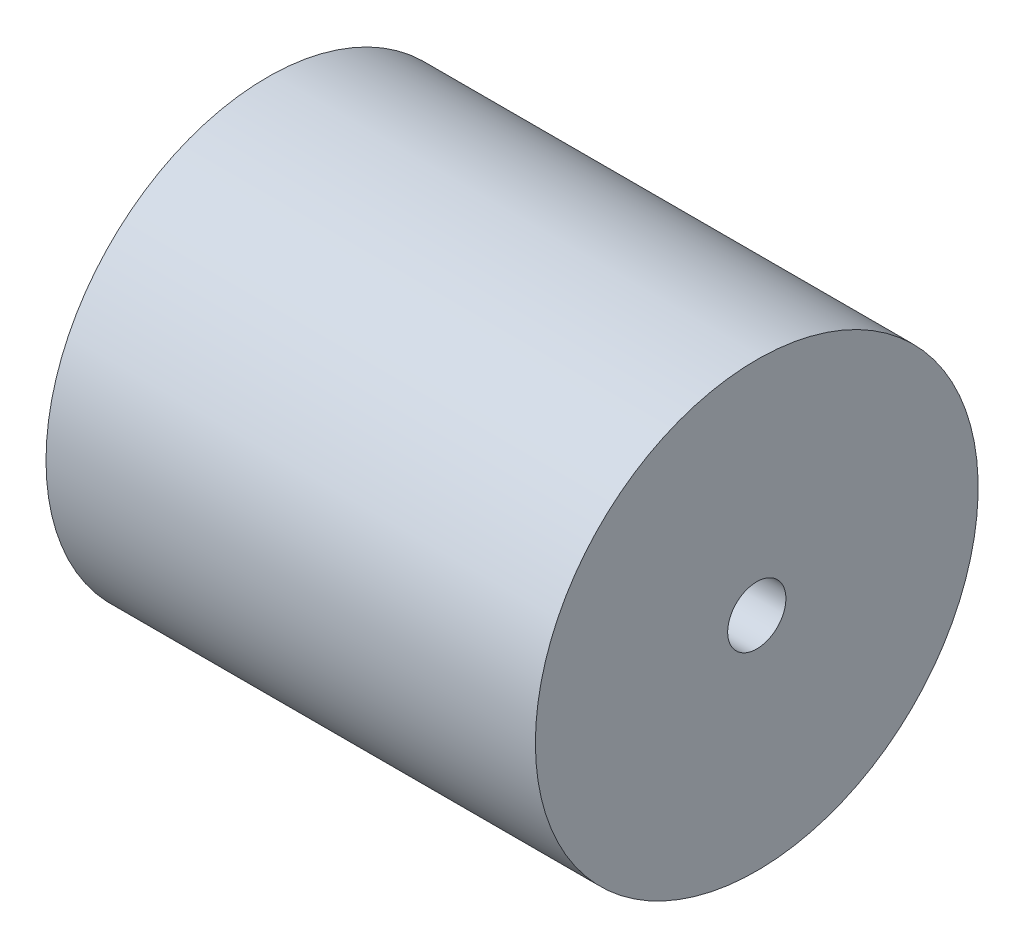
ISO-10303-21;
HEADER;
FILE_DESCRIPTION(('STEP AP214'),'2;1');
FILE_NAME('part.step','',(''),(''),'','','');
FILE_SCHEMA(('AUTOMOTIVE_DESIGN { 1 0 10303 214 1 1 1 1 }'));
ENDSEC;
DATA;
#1=APPLICATION_CONTEXT('core data for automotive mechanical design processes');
#2=APPLICATION_PROTOCOL_DEFINITION('international standard','automotive_design',2000,#1);
#3=PRODUCT_CONTEXT('',#1,'mechanical');
#4=PRODUCT('Part','Part','',(#3));
#5=PRODUCT_RELATED_PRODUCT_CATEGORY('part','',(#4));
#6=PRODUCT_DEFINITION_FORMATION('','',#4);
#7=PRODUCT_DEFINITION_CONTEXT('part definition',#1,'design');
#8=PRODUCT_DEFINITION('design','',#6,#7);
#9=PRODUCT_DEFINITION_SHAPE('','',#8);
#10=(LENGTH_UNIT() NAMED_UNIT(*) SI_UNIT(.MILLI.,.METRE.));
#11=(NAMED_UNIT(*) PLANE_ANGLE_UNIT() SI_UNIT($,.RADIAN.));
#12=(NAMED_UNIT(*) SI_UNIT($,.STERADIAN.) SOLID_ANGLE_UNIT());
#13=UNCERTAINTY_MEASURE_WITH_UNIT(LENGTH_MEASURE(1.E-05),#10,'distance_accuracy_value','');
#14=(GEOMETRIC_REPRESENTATION_CONTEXT(3) GLOBAL_UNCERTAINTY_ASSIGNED_CONTEXT((#13)) GLOBAL_UNIT_ASSIGNED_CONTEXT((#10,
#11,#12)) REPRESENTATION_CONTEXT('',''));
#15=CARTESIAN_POINT('',(0.,0.,0.));
#16=DIRECTION('',(0.,0.,1.));
#17=DIRECTION('',(1.,0.,0.));
#18=AXIS2_PLACEMENT_3D('',#15,#16,#17);
#19=CARTESIAN_POINT('',(21.,0.,0.));
#20=DIRECTION('',(1.,0.,0.));
#21=DIRECTION('',(0.,0.,-1.));
#22=AXIS2_PLACEMENT_3D('',#19,#20,#21);
#23=PLANE('',#22);
#24=CARTESIAN_POINT('',(21.,0.,0.));
#25=DIRECTION('',(1.,0.,0.));
#26=DIRECTION('',(0.,0.,-1.));
#27=AXIS2_PLACEMENT_3D('',#24,#25,#26);
#28=CIRCLE('',#27,9.5);
#29=CARTESIAN_POINT('',(21.,0.,9.5));
#30=VERTEX_POINT('',#29);
#31=EDGE_CURVE('E10',#30,#30,#28,.T.);
#32=ORIENTED_EDGE('',*,*,#31,.T.);
#33=EDGE_LOOP('',(#32));
#34=FACE_BOUND('',#33,.T.);
#35=CARTESIAN_POINT('',(21.,0.,0.));
#36=DIRECTION('',(1.,0.,0.));
#37=DIRECTION('',(0.,0.,-1.));
#38=AXIS2_PLACEMENT_3D('',#35,#36,#37);
#39=CIRCLE('',#38,1.25);
#40=CARTESIAN_POINT('',(21.,0.,1.25));
#41=VERTEX_POINT('',#40);
#42=EDGE_CURVE('E42',#41,#41,#39,.T.);
#43=ORIENTED_EDGE('',*,*,#42,.F.);
#44=EDGE_LOOP('',(#43));
#45=FACE_BOUND('',#44,.T.);
#46=ADVANCED_FACE('F31',(#34,#45),#23,.T.);
#47=CARTESIAN_POINT('',(0.,0.,0.));
#48=DIRECTION('',(1.,0.,0.));
#49=DIRECTION('',(0.,0.,-1.));
#50=AXIS2_PLACEMENT_3D('',#47,#48,#49);
#51=PLANE('',#50);
#52=CARTESIAN_POINT('',(0.,0.,0.));
#53=DIRECTION('',(1.,0.,0.));
#54=DIRECTION('',(0.,0.,-1.));
#55=AXIS2_PLACEMENT_3D('',#52,#53,#54);
#56=CIRCLE('',#55,9.5);
#57=CARTESIAN_POINT('',(0.,0.,9.5));
#58=VERTEX_POINT('',#57);
#59=EDGE_CURVE('E35',#58,#58,#56,.T.);
#60=ORIENTED_EDGE('',*,*,#59,.F.);
#61=EDGE_LOOP('',(#60));
#62=FACE_BOUND('',#61,.T.);
#63=CARTESIAN_POINT('',(0.,0.,0.));
#64=DIRECTION('',(1.,0.,0.));
#65=DIRECTION('',(0.,0.,-1.));
#66=AXIS2_PLACEMENT_3D('',#63,#64,#65);
#67=CIRCLE('',#66,1.25);
#68=CARTESIAN_POINT('',(0.,0.,1.25));
#69=VERTEX_POINT('',#68);
#70=EDGE_CURVE('E44',#69,#69,#67,.T.);
#71=ORIENTED_EDGE('',*,*,#70,.T.);
#72=EDGE_LOOP('',(#71));
#73=FACE_BOUND('',#72,.T.);
#74=ADVANCED_FACE('F54',(#62,#73),#51,.F.);
#75=CARTESIAN_POINT('',(21.,0.,0.));
#76=DIRECTION('',(-1.,0.,0.));
#77=DIRECTION('',(0.,0.,1.));
#78=AXIS2_PLACEMENT_3D('',#75,#76,#77);
#79=CYLINDRICAL_SURFACE('',#78,9.5);
#80=CARTESIAN_POINT('',(21.,0.,9.5));
#81=CARTESIAN_POINT('',(20.78125,0.,9.5));
#82=CARTESIAN_POINT('',(20.5625,0.,9.5));
#83=CARTESIAN_POINT('',(20.125,0.,9.5));
#84=CARTESIAN_POINT('',(19.90625,0.,9.5));
#85=CARTESIAN_POINT('',(19.46875,0.,9.5));
#86=CARTESIAN_POINT('',(19.25,0.,9.5));
#87=CARTESIAN_POINT('',(18.8125,0.,9.5));
#88=CARTESIAN_POINT('',(18.59375,0.,9.5));
#89=CARTESIAN_POINT('',(18.15625,0.,9.5));
#90=CARTESIAN_POINT('',(17.9375,0.,9.5));
#91=CARTESIAN_POINT('',(17.5,0.,9.5));
#92=CARTESIAN_POINT('',(17.28125,0.,9.5));
#93=CARTESIAN_POINT('',(16.84375,0.,9.5));
#94=CARTESIAN_POINT('',(16.625,0.,9.5));
#95=CARTESIAN_POINT('',(16.1875,0.,9.5));
#96=CARTESIAN_POINT('',(15.96875,0.,9.5));
#97=CARTESIAN_POINT('',(15.53125,0.,9.5));
#98=CARTESIAN_POINT('',(15.3125,0.,9.5));
#99=CARTESIAN_POINT('',(14.875,0.,9.5));
#100=CARTESIAN_POINT('',(14.65625,0.,9.5));
#101=CARTESIAN_POINT('',(14.21875,0.,9.5));
#102=CARTESIAN_POINT('',(14.,0.,9.5));
#103=CARTESIAN_POINT('',(13.5625,0.,9.5));
#104=CARTESIAN_POINT('',(13.34375,0.,9.5));
#105=CARTESIAN_POINT('',(12.90625,0.,9.5));
#106=CARTESIAN_POINT('',(12.6875,0.,9.5));
#107=CARTESIAN_POINT('',(12.25,0.,9.5));
#108=CARTESIAN_POINT('',(12.03125,0.,9.5));
#109=CARTESIAN_POINT('',(11.59375,0.,9.5));
#110=CARTESIAN_POINT('',(11.375,0.,9.5));
#111=CARTESIAN_POINT('',(10.9375,0.,9.5));
#112=CARTESIAN_POINT('',(10.71875,0.,9.5));
#113=CARTESIAN_POINT('',(10.28125,0.,9.5));
#114=CARTESIAN_POINT('',(10.0625,0.,9.5));
#115=CARTESIAN_POINT('',(9.625,0.,9.5));
#116=CARTESIAN_POINT('',(9.40625,0.,9.5));
#117=CARTESIAN_POINT('',(8.96875,0.,9.5));
#118=CARTESIAN_POINT('',(8.75,0.,9.5));
#119=CARTESIAN_POINT('',(8.3125,0.,9.5));
#120=CARTESIAN_POINT('',(8.09375,0.,9.5));
#121=CARTESIAN_POINT('',(7.65625,0.,9.5));
#122=CARTESIAN_POINT('',(7.4375,0.,9.5));
#123=CARTESIAN_POINT('',(7.,0.,9.5));
#124=CARTESIAN_POINT('',(6.78125,0.,9.5));
#125=CARTESIAN_POINT('',(6.34375,0.,9.5));
#126=CARTESIAN_POINT('',(6.125,0.,9.5));
#127=CARTESIAN_POINT('',(5.6875,0.,9.5));
#128=CARTESIAN_POINT('',(5.46875,0.,9.5));
#129=CARTESIAN_POINT('',(5.03125,0.,9.5));
#130=CARTESIAN_POINT('',(4.8125,0.,9.5));
#131=CARTESIAN_POINT('',(4.375,0.,9.5));
#132=CARTESIAN_POINT('',(4.15625,0.,9.5));
#133=CARTESIAN_POINT('',(3.71875,0.,9.5));
#134=CARTESIAN_POINT('',(3.5,0.,9.5));
#135=CARTESIAN_POINT('',(3.0625,0.,9.5));
#136=CARTESIAN_POINT('',(2.84375,0.,9.5));
#137=CARTESIAN_POINT('',(2.40625,0.,9.5));
#138=CARTESIAN_POINT('',(2.1875,0.,9.5));
#139=CARTESIAN_POINT('',(1.75,0.,9.5));
#140=CARTESIAN_POINT('',(1.53125,0.,9.5));
#141=CARTESIAN_POINT('',(1.09375,0.,9.5));
#142=CARTESIAN_POINT('',(0.875000000000001,0.,9.5));
#143=CARTESIAN_POINT('',(0.4375,0.,9.5));
#144=CARTESIAN_POINT('',(0.21875,0.,9.5));
#145=CARTESIAN_POINT('',(0.,0.,9.5));
#146=B_SPLINE_CURVE_WITH_KNOTS('',3,(#80,#81,#82,#83,#84,#85,#86,#87,#88,#89,#90,#91,#92,#93,
#94,#95,#96,#97,#98,#99,#100,#101,#102,#103,#104,#105,#106,#107,#108,#109,#110,#111,#112,#113,
#114,#115,#116,#117,#118,#119,#120,#121,#122,#123,#124,#125,#126,#127,#128,#129,#130,#131,#132,
#133,#134,#135,#136,#137,#138,#139,#140,#141,#142,#143,#144,#145),.UNSPECIFIED.,.F.,.F.,(4,2,2,
2,2,2,2,2,2,2,2,2,2,2,2,2,2,2,2,2,2,2,2,2,2,2,2,2,2,2,2,2,4),(0.,0.656249999999997,1.3125,
1.96875,2.625,3.28125,3.9375,4.59375,5.25,5.90625,6.5625,7.21875,7.875,8.53125,9.1875,9.84375,
10.5,11.15625,11.8125,12.46875,13.125,13.78125,14.4375,15.09375,15.75,16.40625,17.0625,17.71875,
18.375,19.03125,19.6875,20.34375,21.),.UNSPECIFIED.);
#147=EDGE_CURVE('BSEAM33',#30,#58,#146,.T.);
#148=ORIENTED_EDGE('',*,*,#31,.F.);
#149=ORIENTED_EDGE('',*,*,#59,.T.);
#150=ORIENTED_EDGE('',*,*,#147,.T.);
#151=ORIENTED_EDGE('',*,*,#147,.F.);
#152=EDGE_LOOP('',(#148,#150,#149,#151));
#153=FACE_BOUND('',#152,.T.);
#154=ADVANCED_FACE('F33',(#153),#79,.T.);
#155=CARTESIAN_POINT('',(21.,0.,0.));
#156=DIRECTION('',(-1.,0.,0.));
#157=DIRECTION('',(0.,0.,1.));
#158=AXIS2_PLACEMENT_3D('',#155,#156,#157);
#159=CYLINDRICAL_SURFACE('',#158,1.25);
#160=CARTESIAN_POINT('',(21.,0.,1.25));
#161=CARTESIAN_POINT('',(20.78125,0.,1.25));
#162=CARTESIAN_POINT('',(20.5625,0.,1.25));
#163=CARTESIAN_POINT('',(20.125,0.,1.25));
#164=CARTESIAN_POINT('',(19.90625,0.,1.25));
#165=CARTESIAN_POINT('',(19.46875,0.,1.25));
#166=CARTESIAN_POINT('',(19.25,0.,1.25));
#167=CARTESIAN_POINT('',(18.8125,0.,1.25));
#168=CARTESIAN_POINT('',(18.59375,0.,1.25));
#169=CARTESIAN_POINT('',(18.15625,0.,1.25));
#170=CARTESIAN_POINT('',(17.9375,0.,1.25));
#171=CARTESIAN_POINT('',(17.5,0.,1.25));
#172=CARTESIAN_POINT('',(17.28125,0.,1.25));
#173=CARTESIAN_POINT('',(16.84375,0.,1.25));
#174=CARTESIAN_POINT('',(16.625,0.,1.25));
#175=CARTESIAN_POINT('',(16.1875,0.,1.25));
#176=CARTESIAN_POINT('',(15.96875,0.,1.25));
#177=CARTESIAN_POINT('',(15.53125,0.,1.25));
#178=CARTESIAN_POINT('',(15.3125,0.,1.25));
#179=CARTESIAN_POINT('',(14.875,0.,1.25));
#180=CARTESIAN_POINT('',(14.65625,0.,1.25));
#181=CARTESIAN_POINT('',(14.21875,0.,1.25));
#182=CARTESIAN_POINT('',(14.,0.,1.25));
#183=CARTESIAN_POINT('',(13.5625,0.,1.25));
#184=CARTESIAN_POINT('',(13.34375,0.,1.25));
#185=CARTESIAN_POINT('',(12.90625,0.,1.25));
#186=CARTESIAN_POINT('',(12.6875,0.,1.25));
#187=CARTESIAN_POINT('',(12.25,0.,1.25));
#188=CARTESIAN_POINT('',(12.03125,0.,1.25));
#189=CARTESIAN_POINT('',(11.59375,0.,1.25));
#190=CARTESIAN_POINT('',(11.375,0.,1.25));
#191=CARTESIAN_POINT('',(10.9375,0.,1.25));
#192=CARTESIAN_POINT('',(10.71875,0.,1.25));
#193=CARTESIAN_POINT('',(10.28125,0.,1.25));
#194=CARTESIAN_POINT('',(10.0625,0.,1.25));
#195=CARTESIAN_POINT('',(9.625,0.,1.25));
#196=CARTESIAN_POINT('',(9.40625,0.,1.25));
#197=CARTESIAN_POINT('',(8.96875,0.,1.25));
#198=CARTESIAN_POINT('',(8.75,0.,1.25));
#199=CARTESIAN_POINT('',(8.3125,0.,1.25));
#200=CARTESIAN_POINT('',(8.09375,0.,1.25));
#201=CARTESIAN_POINT('',(7.65625,0.,1.25));
#202=CARTESIAN_POINT('',(7.4375,0.,1.25));
#203=CARTESIAN_POINT('',(7.,0.,1.25));
#204=CARTESIAN_POINT('',(6.78125,0.,1.25));
#205=CARTESIAN_POINT('',(6.34375,0.,1.25));
#206=CARTESIAN_POINT('',(6.125,0.,1.25));
#207=CARTESIAN_POINT('',(5.6875,0.,1.25));
#208=CARTESIAN_POINT('',(5.46875,0.,1.25));
#209=CARTESIAN_POINT('',(5.03125,0.,1.25));
#210=CARTESIAN_POINT('',(4.8125,0.,1.25));
#211=CARTESIAN_POINT('',(4.375,0.,1.25));
#212=CARTESIAN_POINT('',(4.15625,0.,1.25));
#213=CARTESIAN_POINT('',(3.71875,0.,1.25));
#214=CARTESIAN_POINT('',(3.5,0.,1.25));
#215=CARTESIAN_POINT('',(3.0625,0.,1.25));
#216=CARTESIAN_POINT('',(2.84375,0.,1.25));
#217=CARTESIAN_POINT('',(2.40625,0.,1.25));
#218=CARTESIAN_POINT('',(2.1875,0.,1.25));
#219=CARTESIAN_POINT('',(1.75,0.,1.25));
#220=CARTESIAN_POINT('',(1.53125,0.,1.25));
#221=CARTESIAN_POINT('',(1.09375,0.,1.25));
#222=CARTESIAN_POINT('',(0.875000000000001,0.,1.25));
#223=CARTESIAN_POINT('',(0.4375,0.,1.25));
#224=CARTESIAN_POINT('',(0.21875,0.,1.25));
#225=CARTESIAN_POINT('',(0.,0.,1.25));
#226=B_SPLINE_CURVE_WITH_KNOTS('',3,(#160,#161,#162,#163,#164,#165,#166,#167,#168,#169,#170,
#171,#172,#173,#174,#175,#176,#177,#178,#179,#180,#181,#182,#183,#184,#185,#186,#187,#188,#189,
#190,#191,#192,#193,#194,#195,#196,#197,#198,#199,#200,#201,#202,#203,#204,#205,#206,#207,#208,
#209,#210,#211,#212,#213,#214,#215,#216,#217,#218,#219,#220,#221,#222,#223,#224,#225),
.UNSPECIFIED.,.F.,.F.,(4,2,2,2,2,2,2,2,2,2,2,2,2,2,2,2,2,2,2,2,2,2,2,2,2,2,2,2,2,2,2,2,4),(0.,
0.656250000000001,1.3125,1.96875,2.625,3.28125,3.9375,4.59375,5.25,5.90625,6.5625,7.21875,7.875,
8.53125,9.1875,9.84375,10.5,11.15625,11.8125,12.46875,13.125,13.78125,14.4375,15.09375,15.75,
16.40625,17.0625,17.71875,18.375,19.03125,19.6875,20.34375,21.),.UNSPECIFIED.);
#227=EDGE_CURVE('BSEAM50',#41,#69,#226,.T.);
#228=ORIENTED_EDGE('',*,*,#42,.T.);
#229=ORIENTED_EDGE('',*,*,#70,.F.);
#230=ORIENTED_EDGE('',*,*,#227,.T.);
#231=ORIENTED_EDGE('',*,*,#227,.F.);
#232=EDGE_LOOP('',(#228,#230,#229,#231));
#233=FACE_BOUND('',#232,.T.);
#234=ADVANCED_FACE('F50',(#233),#159,.F.);
#235=CLOSED_SHELL('',(#46,#74,#154,#234));
#236=MANIFOLD_SOLID_BREP('B2',#235);
#237=ADVANCED_BREP_SHAPE_REPRESENTATION('',(#18,#236),#14);
#238=SHAPE_DEFINITION_REPRESENTATION(#9,#237);
ENDSEC;
END-ISO-10303-21;
